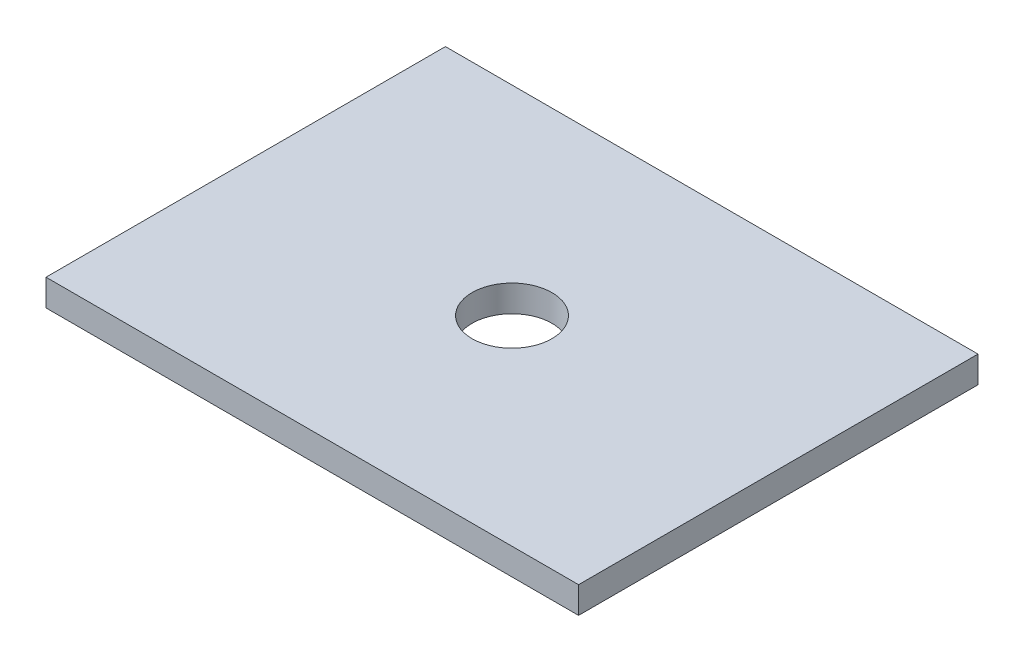
ISO-10303-21;
HEADER;
FILE_DESCRIPTION(('STEP AP214'),'2;1');
FILE_NAME('part.step','',(''),(''),'','','');
FILE_SCHEMA(('AUTOMOTIVE_DESIGN { 1 0 10303 214 1 1 1 1 }'));
ENDSEC;
DATA;
#1=APPLICATION_CONTEXT('core data for automotive mechanical design processes');
#2=APPLICATION_PROTOCOL_DEFINITION('international standard','automotive_design',2000,#1);
#3=PRODUCT_CONTEXT('',#1,'mechanical');
#4=PRODUCT('Part','Part','',(#3));
#5=PRODUCT_RELATED_PRODUCT_CATEGORY('part','',(#4));
#6=PRODUCT_DEFINITION_FORMATION('','',#4);
#7=PRODUCT_DEFINITION_CONTEXT('part definition',#1,'design');
#8=PRODUCT_DEFINITION('design','',#6,#7);
#9=PRODUCT_DEFINITION_SHAPE('','',#8);
#10=(LENGTH_UNIT() NAMED_UNIT(*) SI_UNIT(.MILLI.,.METRE.));
#11=(NAMED_UNIT(*) PLANE_ANGLE_UNIT() SI_UNIT($,.RADIAN.));
#12=(NAMED_UNIT(*) SI_UNIT($,.STERADIAN.) SOLID_ANGLE_UNIT());
#13=UNCERTAINTY_MEASURE_WITH_UNIT(LENGTH_MEASURE(1.E-05),#10,'distance_accuracy_value','');
#14=(GEOMETRIC_REPRESENTATION_CONTEXT(3) GLOBAL_UNCERTAINTY_ASSIGNED_CONTEXT((#13)) GLOBAL_UNIT_ASSIGNED_CONTEXT((#10,
#11,#12)) REPRESENTATION_CONTEXT('',''));
#15=CARTESIAN_POINT('',(0.,0.,0.));
#16=DIRECTION('',(0.,0.,1.));
#17=DIRECTION('',(1.,0.,0.));
#18=AXIS2_PLACEMENT_3D('',#15,#16,#17);
#19=CARTESIAN_POINT('',(20.,2.,15.));
#20=DIRECTION('',(-1.,0.,0.));
#21=DIRECTION('',(0.,0.,1.));
#22=AXIS2_PLACEMENT_3D('',#19,#20,#21);
#23=PLANE('',#22);
#24=DIRECTION('',(0.,0.,-1.));
#25=VECTOR('',#24,1.);
#26=CARTESIAN_POINT('',(20.,0.,15.));
#27=LINE('',#26,#25);
#28=CARTESIAN_POINT('',(20.,0.,15.));
#29=VERTEX_POINT('',#28);
#30=CARTESIAN_POINT('',(20.,0.,-15.));
#31=VERTEX_POINT('',#30);
#32=EDGE_CURVE('E107',#29,#31,#27,.T.);
#33=ORIENTED_EDGE('',*,*,#32,.T.);
#34=DIRECTION('',(0.,-1.,0.));
#35=VECTOR('',#34,1.);
#36=CARTESIAN_POINT('',(20.,2.,-15.));
#37=LINE('',#36,#35);
#38=CARTESIAN_POINT('',(20.,2.,-15.));
#39=VERTEX_POINT('',#38);
#40=EDGE_CURVE('E11',#39,#31,#37,.T.);
#41=ORIENTED_EDGE('',*,*,#40,.F.);
#42=DIRECTION('',(0.,0.,-1.));
#43=VECTOR('',#42,1.);
#44=CARTESIAN_POINT('',(20.,2.,15.));
#45=LINE('',#44,#43);
#46=CARTESIAN_POINT('',(20.,2.,15.));
#47=VERTEX_POINT('',#46);
#48=EDGE_CURVE('E91',#47,#39,#45,.T.);
#49=ORIENTED_EDGE('',*,*,#48,.F.);
#50=DIRECTION('',(0.,-1.,0.));
#51=VECTOR('',#50,1.);
#52=CARTESIAN_POINT('',(20.,2.,15.));
#53=LINE('',#52,#51);
#54=EDGE_CURVE('E103',#47,#29,#53,.T.);
#55=ORIENTED_EDGE('',*,*,#54,.T.);
#56=EDGE_LOOP('',(#33,#41,#49,#55));
#57=FACE_BOUND('',#56,.T.);
#58=ADVANCED_FACE('F39',(#57),#23,.F.);
#59=CARTESIAN_POINT('',(-20.,2.,-15.));
#60=DIRECTION('',(0.,0.,1.));
#61=DIRECTION('',(1.,0.,0.));
#62=AXIS2_PLACEMENT_3D('',#59,#60,#61);
#63=PLANE('',#62);
#64=DIRECTION('',(-1.,0.,0.));
#65=VECTOR('',#64,1.);
#66=CARTESIAN_POINT('',(-20.,0.,-15.));
#67=LINE('',#66,#65);
#68=CARTESIAN_POINT('',(-20.,0.,-15.));
#69=VERTEX_POINT('',#68);
#70=EDGE_CURVE('E96',#31,#69,#67,.T.);
#71=ORIENTED_EDGE('',*,*,#70,.T.);
#72=DIRECTION('',(0.,-1.,0.));
#73=VECTOR('',#72,1.);
#74=CARTESIAN_POINT('',(-20.,2.,-15.));
#75=LINE('',#74,#73);
#76=CARTESIAN_POINT('',(-20.,2.,-15.));
#77=VERTEX_POINT('',#76);
#78=EDGE_CURVE('E48',#77,#69,#75,.T.);
#79=ORIENTED_EDGE('',*,*,#78,.F.);
#80=DIRECTION('',(-1.,0.,0.));
#81=VECTOR('',#80,1.);
#82=CARTESIAN_POINT('',(-20.,2.,-15.));
#83=LINE('',#82,#81);
#84=EDGE_CURVE('E86',#39,#77,#83,.T.);
#85=ORIENTED_EDGE('',*,*,#84,.F.);
#86=ORIENTED_EDGE('',*,*,#40,.T.);
#87=EDGE_LOOP('',(#71,#79,#85,#86));
#88=FACE_BOUND('',#87,.T.);
#89=ADVANCED_FACE('F95',(#88),#63,.F.);
#90=CARTESIAN_POINT('',(-20.,2.,15.));
#91=DIRECTION('',(1.,0.,0.));
#92=DIRECTION('',(0.,0.,-1.));
#93=AXIS2_PLACEMENT_3D('',#90,#91,#92);
#94=PLANE('',#93);
#95=DIRECTION('',(0.,0.,1.));
#96=VECTOR('',#95,1.);
#97=CARTESIAN_POINT('',(-20.,0.,15.));
#98=LINE('',#97,#96);
#99=CARTESIAN_POINT('',(-20.,0.,15.));
#100=VERTEX_POINT('',#99);
#101=EDGE_CURVE('E73',#69,#100,#98,.T.);
#102=ORIENTED_EDGE('',*,*,#101,.T.);
#103=DIRECTION('',(0.,-1.,0.));
#104=VECTOR('',#103,1.);
#105=CARTESIAN_POINT('',(-20.,2.,15.));
#106=LINE('',#105,#104);
#107=CARTESIAN_POINT('',(-20.,2.,15.));
#108=VERTEX_POINT('',#107);
#109=EDGE_CURVE('E98',#108,#100,#106,.T.);
#110=ORIENTED_EDGE('',*,*,#109,.F.);
#111=DIRECTION('',(0.,0.,1.));
#112=VECTOR('',#111,1.);
#113=CARTESIAN_POINT('',(-20.,2.,15.));
#114=LINE('',#113,#112);
#115=EDGE_CURVE('E89',#77,#108,#114,.T.);
#116=ORIENTED_EDGE('',*,*,#115,.F.);
#117=ORIENTED_EDGE('',*,*,#78,.T.);
#118=EDGE_LOOP('',(#102,#110,#116,#117));
#119=FACE_BOUND('',#118,.T.);
#120=ADVANCED_FACE('F99',(#119),#94,.F.);
#121=CARTESIAN_POINT('',(-20.,2.,15.));
#122=DIRECTION('',(0.,0.,-1.));
#123=DIRECTION('',(-1.,0.,0.));
#124=AXIS2_PLACEMENT_3D('',#121,#122,#123);
#125=PLANE('',#124);
#126=DIRECTION('',(1.,0.,0.));
#127=VECTOR('',#126,1.);
#128=CARTESIAN_POINT('',(-20.,0.,15.));
#129=LINE('',#128,#127);
#130=EDGE_CURVE('E79',#100,#29,#129,.T.);
#131=ORIENTED_EDGE('',*,*,#130,.T.);
#132=ORIENTED_EDGE('',*,*,#54,.F.);
#133=DIRECTION('',(1.,0.,0.));
#134=VECTOR('',#133,1.);
#135=CARTESIAN_POINT('',(-20.,2.,15.));
#136=LINE('',#135,#134);
#137=EDGE_CURVE('E56',#108,#47,#136,.T.);
#138=ORIENTED_EDGE('',*,*,#137,.F.);
#139=ORIENTED_EDGE('',*,*,#109,.T.);
#140=EDGE_LOOP('',(#131,#132,#138,#139));
#141=FACE_BOUND('',#140,.T.);
#142=ADVANCED_FACE('F121',(#141),#125,.F.);
#143=CARTESIAN_POINT('',(0.,2.,0.));
#144=DIRECTION('',(0.,-1.,0.));
#145=DIRECTION('',(0.,0.,-1.));
#146=AXIS2_PLACEMENT_3D('',#143,#144,#145);
#147=PLANE('',#146);
#148=CARTESIAN_POINT('',(0.,2.,0.));
#149=DIRECTION('',(0.,1.,0.));
#150=DIRECTION('',(0.,0.,1.));
#151=AXIS2_PLACEMENT_3D('',#148,#149,#150);
#152=CIRCLE('',#151,3.);
#153=CARTESIAN_POINT('',(0.,2.,3.));
#154=VERTEX_POINT('',#153);
#155=EDGE_CURVE('E128',#154,#154,#152,.T.);
#156=ORIENTED_EDGE('',*,*,#155,.F.);
#157=EDGE_LOOP('',(#156));
#158=FACE_BOUND('',#157,.T.);
#159=ORIENTED_EDGE('',*,*,#48,.T.);
#160=ORIENTED_EDGE('',*,*,#84,.T.);
#161=ORIENTED_EDGE('',*,*,#115,.T.);
#162=ORIENTED_EDGE('',*,*,#137,.T.);
#163=EDGE_LOOP('',(#159,#160,#161,#162));
#164=FACE_BOUND('',#163,.T.);
#165=ADVANCED_FACE('F87',(#158,#164),#147,.F.);
#166=CARTESIAN_POINT('',(0.,0.,0.));
#167=DIRECTION('',(0.,-1.,0.));
#168=DIRECTION('',(0.,0.,-1.));
#169=AXIS2_PLACEMENT_3D('',#166,#167,#168);
#170=PLANE('',#169);
#171=CARTESIAN_POINT('',(0.,0.,0.));
#172=DIRECTION('',(0.,1.,0.));
#173=DIRECTION('',(0.,0.,1.));
#174=AXIS2_PLACEMENT_3D('',#171,#172,#173);
#175=CIRCLE('',#174,3.);
#176=CARTESIAN_POINT('',(0.,0.,3.));
#177=VERTEX_POINT('',#176);
#178=EDGE_CURVE('E111',#177,#177,#175,.T.);
#179=ORIENTED_EDGE('',*,*,#178,.T.);
#180=EDGE_LOOP('',(#179));
#181=FACE_BOUND('',#180,.T.);
#182=ORIENTED_EDGE('',*,*,#32,.F.);
#183=ORIENTED_EDGE('',*,*,#130,.F.);
#184=ORIENTED_EDGE('',*,*,#101,.F.);
#185=ORIENTED_EDGE('',*,*,#70,.F.);
#186=EDGE_LOOP('',(#182,#183,#184,#185));
#187=FACE_BOUND('',#186,.T.);
#188=ADVANCED_FACE('F124',(#181,#187),#170,.T.);
#189=CARTESIAN_POINT('',(0.,0.,0.));
#190=DIRECTION('',(0.,1.,0.));
#191=DIRECTION('',(0.,0.,1.));
#192=AXIS2_PLACEMENT_3D('',#189,#190,#191);
#193=CYLINDRICAL_SURFACE('',#192,3.);
#194=ORIENTED_EDGE('',*,*,#178,.F.);
#195=EDGE_LOOP('',(#194));
#196=FACE_BOUND('',#195,.T.);
#197=ORIENTED_EDGE('',*,*,#155,.T.);
#198=EDGE_LOOP('',(#197));
#199=FACE_BOUND('',#198,.T.);
#200=ADVANCED_FACE('F137',(#196,#199),#193,.F.);
#201=CLOSED_SHELL('',(#58,#89,#120,#142,#165,#188,#200));
#202=MANIFOLD_SOLID_BREP('B2',#201);
#203=ADVANCED_BREP_SHAPE_REPRESENTATION('',(#18,#202),#14);
#204=SHAPE_DEFINITION_REPRESENTATION(#9,#203);
ENDSEC;
END-ISO-10303-21;
